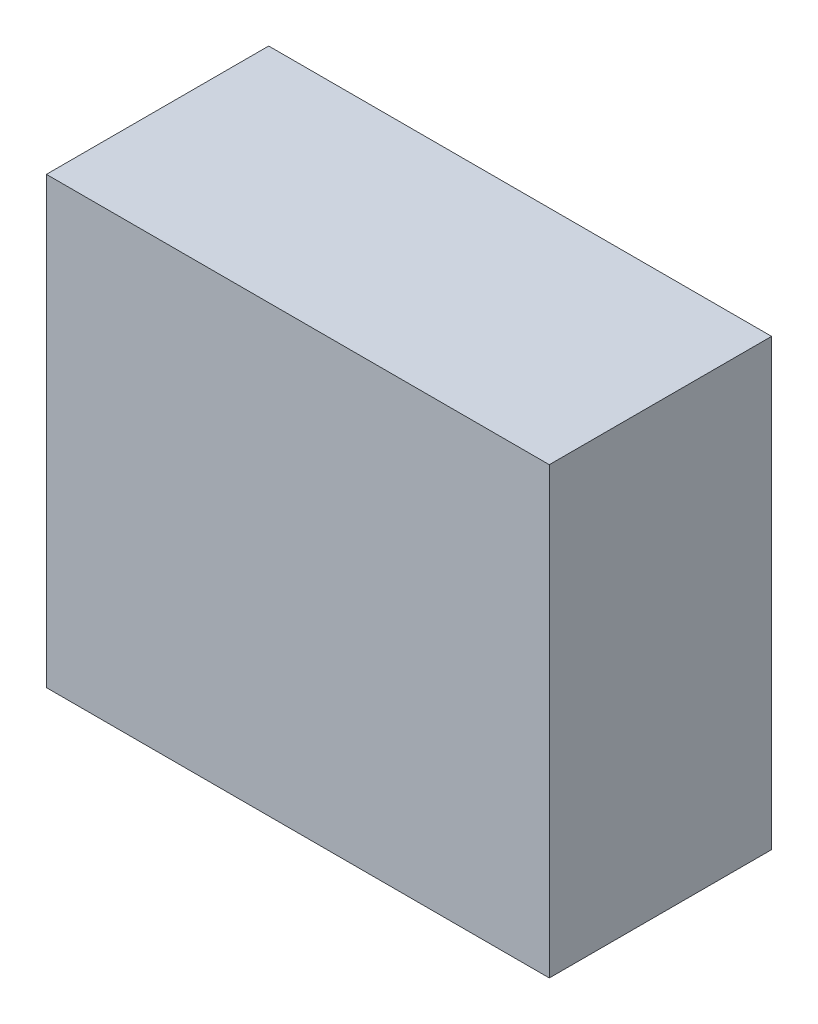
ISO-10303-21;
HEADER;
FILE_DESCRIPTION(('STEP AP214'),'2;1');
FILE_NAME('part.step','',(''),(''),'','','');
FILE_SCHEMA(('AUTOMOTIVE_DESIGN { 1 0 10303 214 1 1 1 1 }'));
ENDSEC;
DATA;
#1=APPLICATION_CONTEXT('core data for automotive mechanical design processes');
#2=APPLICATION_PROTOCOL_DEFINITION('international standard','automotive_design',2000,#1);
#3=PRODUCT_CONTEXT('',#1,'mechanical');
#4=PRODUCT('Part','Part','',(#3));
#5=PRODUCT_RELATED_PRODUCT_CATEGORY('part','',(#4));
#6=PRODUCT_DEFINITION_FORMATION('','',#4);
#7=PRODUCT_DEFINITION_CONTEXT('part definition',#1,'design');
#8=PRODUCT_DEFINITION('design','',#6,#7);
#9=PRODUCT_DEFINITION_SHAPE('','',#8);
#10=(LENGTH_UNIT() NAMED_UNIT(*) SI_UNIT(.MILLI.,.METRE.));
#11=(NAMED_UNIT(*) PLANE_ANGLE_UNIT() SI_UNIT($,.RADIAN.));
#12=(NAMED_UNIT(*) SI_UNIT($,.STERADIAN.) SOLID_ANGLE_UNIT());
#13=UNCERTAINTY_MEASURE_WITH_UNIT(LENGTH_MEASURE(1.E-05),#10,'distance_accuracy_value','');
#14=(GEOMETRIC_REPRESENTATION_CONTEXT(3) GLOBAL_UNCERTAINTY_ASSIGNED_CONTEXT((#13)) GLOBAL_UNIT_ASSIGNED_CONTEXT((#10,
#11,#12)) REPRESENTATION_CONTEXT('',''));
#15=CARTESIAN_POINT('',(0.,0.,0.));
#16=DIRECTION('',(0.,0.,1.));
#17=DIRECTION('',(1.,0.,0.));
#18=AXIS2_PLACEMENT_3D('',#15,#16,#17);
#19=CARTESIAN_POINT('',(0.,16.,0.));
#20=DIRECTION('',(1.,0.,0.));
#21=DIRECTION('',(0.,0.,-1.));
#22=AXIS2_PLACEMENT_3D('',#19,#20,#21);
#23=PLANE('',#22);
#24=DIRECTION('',(0.,0.,1.));
#25=VECTOR('',#24,1.);
#26=CARTESIAN_POINT('',(0.,0.,0.));
#27=LINE('',#26,#25);
#28=CARTESIAN_POINT('',(0.,0.,0.));
#29=VERTEX_POINT('',#28);
#30=CARTESIAN_POINT('',(0.,0.,8.));
#31=VERTEX_POINT('',#30);
#32=EDGE_CURVE('E113',#29,#31,#27,.T.);
#33=ORIENTED_EDGE('',*,*,#32,.T.);
#34=DIRECTION('',(0.,-1.,0.));
#35=VECTOR('',#34,1.);
#36=CARTESIAN_POINT('',(0.,16.,8.));
#37=LINE('',#36,#35);
#38=CARTESIAN_POINT('',(0.,16.,8.));
#39=VERTEX_POINT('',#38);
#40=EDGE_CURVE('E11',#39,#31,#37,.T.);
#41=ORIENTED_EDGE('',*,*,#40,.F.);
#42=DIRECTION('',(0.,0.,1.));
#43=VECTOR('',#42,1.);
#44=CARTESIAN_POINT('',(0.,16.,0.));
#45=LINE('',#44,#43);
#46=CARTESIAN_POINT('',(0.,16.,0.));
#47=VERTEX_POINT('',#46);
#48=EDGE_CURVE('E97',#47,#39,#45,.T.);
#49=ORIENTED_EDGE('',*,*,#48,.F.);
#50=DIRECTION('',(0.,-1.,0.));
#51=VECTOR('',#50,1.);
#52=CARTESIAN_POINT('',(0.,16.,0.));
#53=LINE('',#52,#51);
#54=EDGE_CURVE('E109',#47,#29,#53,.T.);
#55=ORIENTED_EDGE('',*,*,#54,.T.);
#56=EDGE_LOOP('',(#33,#41,#49,#55));
#57=FACE_BOUND('',#56,.T.);
#58=ADVANCED_FACE('F45',(#57),#23,.F.);
#59=CARTESIAN_POINT('',(0.,16.,8.));
#60=DIRECTION('',(0.,0.,-1.));
#61=DIRECTION('',(-1.,0.,0.));
#62=AXIS2_PLACEMENT_3D('',#59,#60,#61);
#63=PLANE('',#62);
#64=DIRECTION('',(1.,0.,0.));
#65=VECTOR('',#64,1.);
#66=CARTESIAN_POINT('',(0.,0.,8.));
#67=LINE('',#66,#65);
#68=CARTESIAN_POINT('',(18.1,0.,8.));
#69=VERTEX_POINT('',#68);
#70=EDGE_CURVE('E102',#31,#69,#67,.T.);
#71=ORIENTED_EDGE('',*,*,#70,.T.);
#72=DIRECTION('',(0.,-1.,0.));
#73=VECTOR('',#72,1.);
#74=CARTESIAN_POINT('',(18.1,16.,8.));
#75=LINE('',#74,#73);
#76=CARTESIAN_POINT('',(18.1,16.,8.));
#77=VERTEX_POINT('',#76);
#78=EDGE_CURVE('E54',#77,#69,#75,.T.);
#79=ORIENTED_EDGE('',*,*,#78,.F.);
#80=DIRECTION('',(1.,0.,0.));
#81=VECTOR('',#80,1.);
#82=CARTESIAN_POINT('',(0.,16.,8.));
#83=LINE('',#82,#81);
#84=EDGE_CURVE('E92',#39,#77,#83,.T.);
#85=ORIENTED_EDGE('',*,*,#84,.F.);
#86=ORIENTED_EDGE('',*,*,#40,.T.);
#87=EDGE_LOOP('',(#71,#79,#85,#86));
#88=FACE_BOUND('',#87,.T.);
#89=ADVANCED_FACE('F101',(#88),#63,.F.);
#90=CARTESIAN_POINT('',(18.1,16.,0.));
#91=DIRECTION('',(-1.,0.,0.));
#92=DIRECTION('',(0.,0.,1.));
#93=AXIS2_PLACEMENT_3D('',#90,#91,#92);
#94=PLANE('',#93);
#95=DIRECTION('',(0.,0.,-1.));
#96=VECTOR('',#95,1.);
#97=CARTESIAN_POINT('',(18.1,0.,0.));
#98=LINE('',#97,#96);
#99=CARTESIAN_POINT('',(18.1,0.,0.));
#100=VERTEX_POINT('',#99);
#101=EDGE_CURVE('E79',#69,#100,#98,.T.);
#102=ORIENTED_EDGE('',*,*,#101,.T.);
#103=DIRECTION('',(0.,-1.,0.));
#104=VECTOR('',#103,1.);
#105=CARTESIAN_POINT('',(18.1,16.,0.));
#106=LINE('',#105,#104);
#107=CARTESIAN_POINT('',(18.1,16.,0.));
#108=VERTEX_POINT('',#107);
#109=EDGE_CURVE('E104',#108,#100,#106,.T.);
#110=ORIENTED_EDGE('',*,*,#109,.F.);
#111=DIRECTION('',(0.,0.,-1.));
#112=VECTOR('',#111,1.);
#113=CARTESIAN_POINT('',(18.1,16.,0.));
#114=LINE('',#113,#112);
#115=EDGE_CURVE('E95',#77,#108,#114,.T.);
#116=ORIENTED_EDGE('',*,*,#115,.F.);
#117=ORIENTED_EDGE('',*,*,#78,.T.);
#118=EDGE_LOOP('',(#102,#110,#116,#117));
#119=FACE_BOUND('',#118,.T.);
#120=ADVANCED_FACE('F105',(#119),#94,.F.);
#121=CARTESIAN_POINT('',(0.,16.,0.));
#122=DIRECTION('',(0.,0.,1.));
#123=DIRECTION('',(1.,0.,0.));
#124=AXIS2_PLACEMENT_3D('',#121,#122,#123);
#125=PLANE('',#124);
#126=DIRECTION('',(-1.,0.,0.));
#127=VECTOR('',#126,1.);
#128=CARTESIAN_POINT('',(0.,0.,0.));
#129=LINE('',#128,#127);
#130=EDGE_CURVE('E85',#100,#29,#129,.T.);
#131=ORIENTED_EDGE('',*,*,#130,.T.);
#132=ORIENTED_EDGE('',*,*,#54,.F.);
#133=DIRECTION('',(-1.,0.,0.));
#134=VECTOR('',#133,1.);
#135=CARTESIAN_POINT('',(0.,16.,0.));
#136=LINE('',#135,#134);
#137=EDGE_CURVE('E62',#108,#47,#136,.T.);
#138=ORIENTED_EDGE('',*,*,#137,.F.);
#139=ORIENTED_EDGE('',*,*,#109,.T.);
#140=EDGE_LOOP('',(#131,#132,#138,#139));
#141=FACE_BOUND('',#140,.T.);
#142=ADVANCED_FACE('F126',(#141),#125,.F.);
#143=CARTESIAN_POINT('',(0.,16.,0.));
#144=DIRECTION('',(0.,1.,0.));
#145=DIRECTION('',(0.,0.,1.));
#146=AXIS2_PLACEMENT_3D('',#143,#144,#145);
#147=PLANE('',#146);
#148=ORIENTED_EDGE('',*,*,#48,.T.);
#149=ORIENTED_EDGE('',*,*,#84,.T.);
#150=ORIENTED_EDGE('',*,*,#115,.T.);
#151=ORIENTED_EDGE('',*,*,#137,.T.);
#152=EDGE_LOOP('',(#148,#149,#150,#151));
#153=FACE_BOUND('',#152,.T.);
#154=ADVANCED_FACE('F93',(#153),#147,.T.);
#155=CARTESIAN_POINT('',(0.,0.,0.));
#156=DIRECTION('',(0.,1.,0.));
#157=DIRECTION('',(0.,0.,1.));
#158=AXIS2_PLACEMENT_3D('',#155,#156,#157);
#159=PLANE('',#158);
#160=ORIENTED_EDGE('',*,*,#32,.F.);
#161=ORIENTED_EDGE('',*,*,#130,.F.);
#162=ORIENTED_EDGE('',*,*,#101,.F.);
#163=ORIENTED_EDGE('',*,*,#70,.F.);
#164=EDGE_LOOP('',(#160,#161,#162,#163));
#165=FACE_BOUND('',#164,.T.);
#166=ADVANCED_FACE('F129',(#165),#159,.F.);
#167=CLOSED_SHELL('',(#58,#89,#120,#142,#154,#166));
#168=MANIFOLD_SOLID_BREP('B2',#167);
#169=ADVANCED_BREP_SHAPE_REPRESENTATION('',(#18,#168),#14);
#170=SHAPE_DEFINITION_REPRESENTATION(#9,#169);
ENDSEC;
END-ISO-10303-21;
